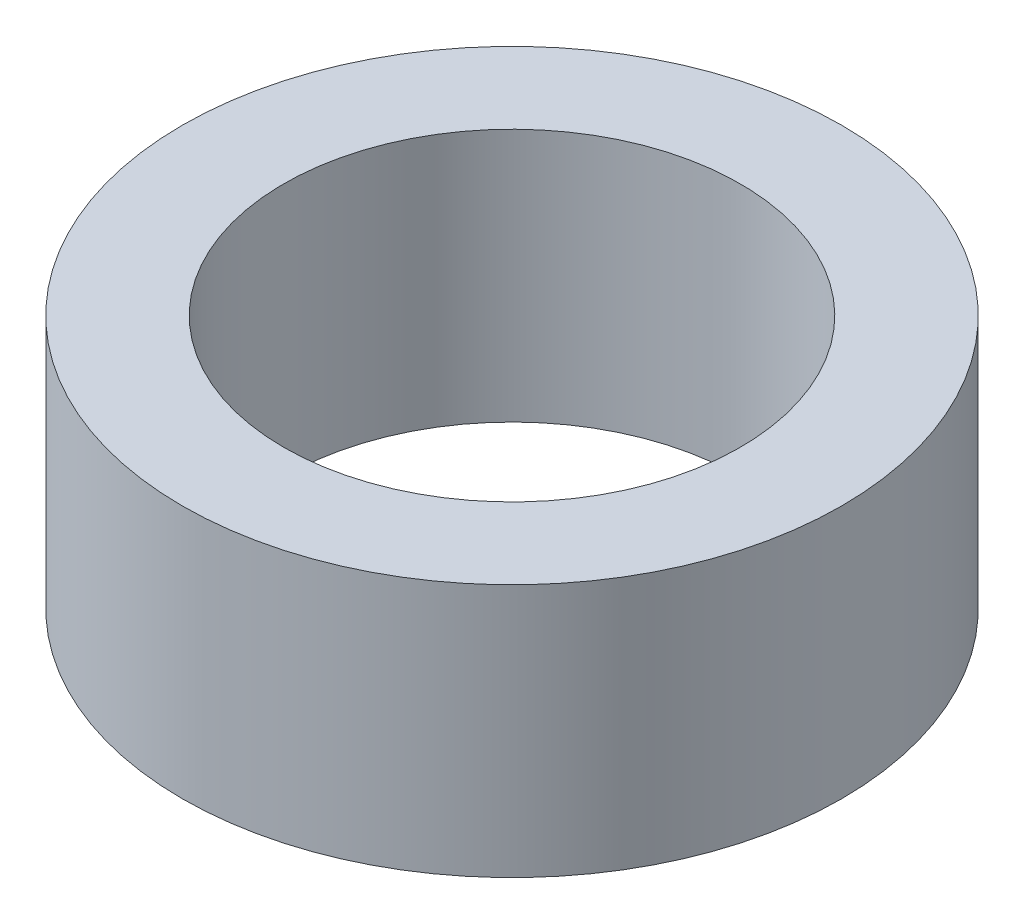
ISO-10303-21;
HEADER;
FILE_DESCRIPTION(('STEP AP214'),'2;1');
FILE_NAME('part.step','',(''),(''),'','','');
FILE_SCHEMA(('AUTOMOTIVE_DESIGN { 1 0 10303 214 1 1 1 1 }'));
ENDSEC;
DATA;
#1=APPLICATION_CONTEXT('core data for automotive mechanical design processes');
#2=APPLICATION_PROTOCOL_DEFINITION('international standard','automotive_design',2000,#1);
#3=PRODUCT_CONTEXT('',#1,'mechanical');
#4=PRODUCT('Part','Part','',(#3));
#5=PRODUCT_RELATED_PRODUCT_CATEGORY('part','',(#4));
#6=PRODUCT_DEFINITION_FORMATION('','',#4);
#7=PRODUCT_DEFINITION_CONTEXT('part definition',#1,'design');
#8=PRODUCT_DEFINITION('design','',#6,#7);
#9=PRODUCT_DEFINITION_SHAPE('','',#8);
#10=(LENGTH_UNIT() NAMED_UNIT(*) SI_UNIT(.MILLI.,.METRE.));
#11=(NAMED_UNIT(*) PLANE_ANGLE_UNIT() SI_UNIT($,.RADIAN.));
#12=(NAMED_UNIT(*) SI_UNIT($,.STERADIAN.) SOLID_ANGLE_UNIT());
#13=UNCERTAINTY_MEASURE_WITH_UNIT(LENGTH_MEASURE(1.E-05),#10,'distance_accuracy_value','');
#14=(GEOMETRIC_REPRESENTATION_CONTEXT(3) GLOBAL_UNCERTAINTY_ASSIGNED_CONTEXT((#13)) GLOBAL_UNIT_ASSIGNED_CONTEXT((#10,
#11,#12)) REPRESENTATION_CONTEXT('',''));
#15=CARTESIAN_POINT('',(0.,0.,0.));
#16=DIRECTION('',(0.,0.,1.));
#17=DIRECTION('',(1.,0.,0.));
#18=AXIS2_PLACEMENT_3D('',#15,#16,#17);
#19=CARTESIAN_POINT('',(0.,5.,0.));
#20=DIRECTION('',(0.,1.,0.));
#21=DIRECTION('',(0.,0.,1.));
#22=AXIS2_PLACEMENT_3D('',#19,#20,#21);
#23=PLANE('',#22);
#24=CARTESIAN_POINT('',(0.,5.,0.));
#25=DIRECTION('',(0.,1.,0.));
#26=DIRECTION('',(0.,0.,1.));
#27=AXIS2_PLACEMENT_3D('',#24,#25,#26);
#28=CIRCLE('',#27,6.5);
#29=CARTESIAN_POINT('',(0.,5.,6.5));
#30=VERTEX_POINT('',#29);
#31=EDGE_CURVE('E10',#30,#30,#28,.T.);
#32=ORIENTED_EDGE('',*,*,#31,.T.);
#33=EDGE_LOOP('',(#32));
#34=FACE_BOUND('',#33,.T.);
#35=CARTESIAN_POINT('',(0.,5.,0.));
#36=DIRECTION('',(0.,1.,0.));
#37=DIRECTION('',(0.,0.,1.));
#38=AXIS2_PLACEMENT_3D('',#35,#36,#37);
#39=CIRCLE('',#38,4.5);
#40=CARTESIAN_POINT('',(0.,5.,4.5));
#41=VERTEX_POINT('',#40);
#42=EDGE_CURVE('E54',#41,#41,#39,.T.);
#43=ORIENTED_EDGE('',*,*,#42,.F.);
#44=EDGE_LOOP('',(#43));
#45=FACE_BOUND('',#44,.T.);
#46=ADVANCED_FACE('F41',(#34,#45),#23,.T.);
#47=CARTESIAN_POINT('',(0.,0.,0.));
#48=DIRECTION('',(0.,1.,0.));
#49=DIRECTION('',(0.,0.,1.));
#50=AXIS2_PLACEMENT_3D('',#47,#48,#49);
#51=PLANE('',#50);
#52=CARTESIAN_POINT('',(0.,0.,0.));
#53=DIRECTION('',(0.,1.,0.));
#54=DIRECTION('',(0.,0.,1.));
#55=AXIS2_PLACEMENT_3D('',#52,#53,#54);
#56=CIRCLE('',#55,6.5);
#57=CARTESIAN_POINT('',(0.,0.,6.5));
#58=VERTEX_POINT('',#57);
#59=EDGE_CURVE('E45',#58,#58,#56,.T.);
#60=ORIENTED_EDGE('',*,*,#59,.F.);
#61=EDGE_LOOP('',(#60));
#62=FACE_BOUND('',#61,.T.);
#63=CARTESIAN_POINT('',(0.,0.,0.));
#64=DIRECTION('',(0.,1.,0.));
#65=DIRECTION('',(0.,0.,1.));
#66=AXIS2_PLACEMENT_3D('',#63,#64,#65);
#67=CIRCLE('',#66,4.5);
#68=CARTESIAN_POINT('',(0.,0.,4.5));
#69=VERTEX_POINT('',#68);
#70=EDGE_CURVE('E56',#69,#69,#67,.T.);
#71=ORIENTED_EDGE('',*,*,#70,.T.);
#72=EDGE_LOOP('',(#71));
#73=FACE_BOUND('',#72,.T.);
#74=ADVANCED_FACE('F68',(#62,#73),#51,.F.);
#75=CARTESIAN_POINT('',(0.,5.,0.));
#76=DIRECTION('',(0.,-1.,0.));
#77=DIRECTION('',(0.,0.,-1.));
#78=AXIS2_PLACEMENT_3D('',#75,#76,#77);
#79=CYLINDRICAL_SURFACE('',#78,6.5);
#80=ORIENTED_EDGE('',*,*,#31,.F.);
#81=EDGE_LOOP('',(#80));
#82=FACE_BOUND('',#81,.T.);
#83=ORIENTED_EDGE('',*,*,#59,.T.);
#84=EDGE_LOOP('',(#83));
#85=FACE_BOUND('',#84,.T.);
#86=ADVANCED_FACE('F43',(#82,#85),#79,.T.);
#87=CARTESIAN_POINT('',(0.,5.,0.));
#88=DIRECTION('',(0.,-1.,0.));
#89=DIRECTION('',(0.,0.,-1.));
#90=AXIS2_PLACEMENT_3D('',#87,#88,#89);
#91=CYLINDRICAL_SURFACE('',#90,4.5);
#92=ORIENTED_EDGE('',*,*,#42,.T.);
#93=EDGE_LOOP('',(#92));
#94=FACE_BOUND('',#93,.T.);
#95=ORIENTED_EDGE('',*,*,#70,.F.);
#96=EDGE_LOOP('',(#95));
#97=FACE_BOUND('',#96,.T.);
#98=ADVANCED_FACE('F64',(#94,#97),#91,.F.);
#99=CLOSED_SHELL('',(#46,#74,#86,#98));
#100=MANIFOLD_SOLID_BREP('B2',#99);
#101=ADVANCED_BREP_SHAPE_REPRESENTATION('',(#18,#100),#14);
#102=SHAPE_DEFINITION_REPRESENTATION(#9,#101);
ENDSEC;
END-ISO-10303-21;
